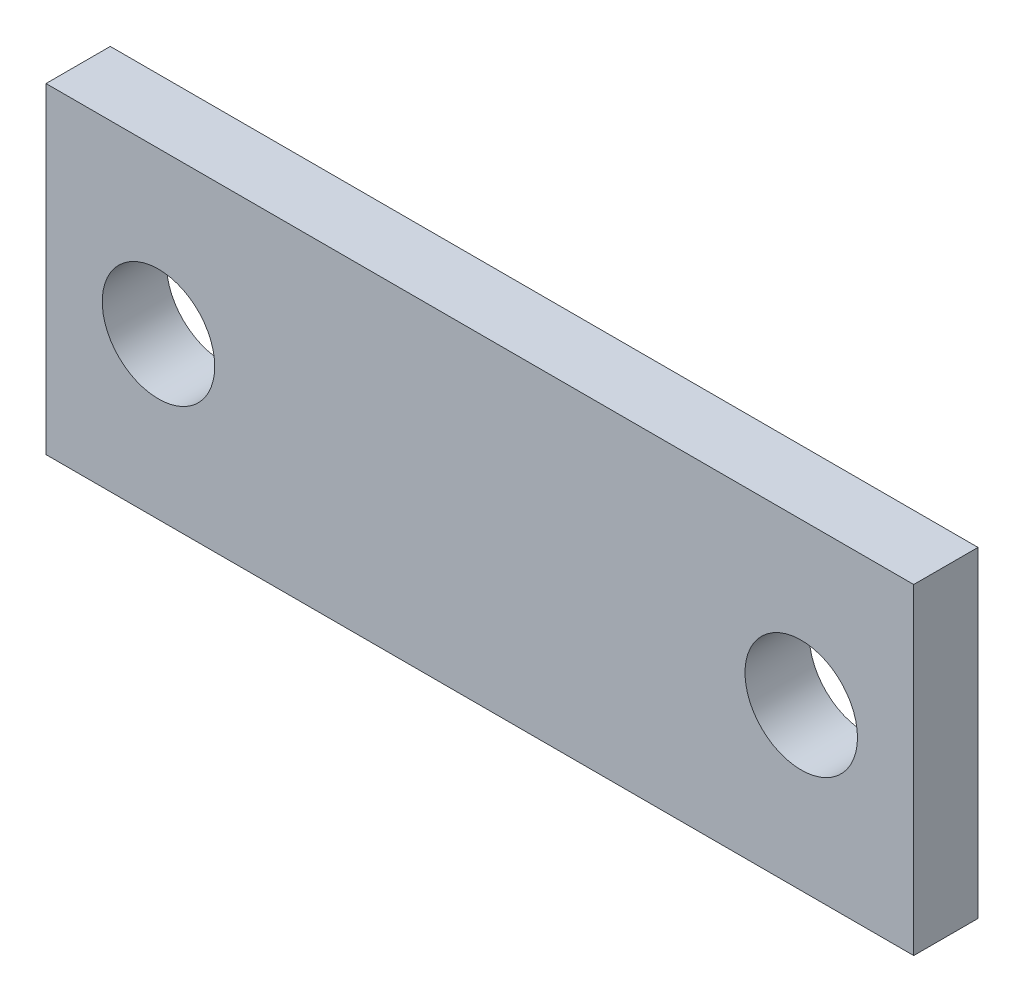
ISO-10303-21;
HEADER;
FILE_DESCRIPTION(('STEP AP214'),'2;1');
FILE_NAME('part.step','',(''),(''),'','','');
FILE_SCHEMA(('AUTOMOTIVE_DESIGN { 1 0 10303 214 1 1 1 1 }'));
ENDSEC;
DATA;
#1=APPLICATION_CONTEXT('core data for automotive mechanical design processes');
#2=APPLICATION_PROTOCOL_DEFINITION('international standard','automotive_design',2000,#1);
#3=PRODUCT_CONTEXT('',#1,'mechanical');
#4=PRODUCT('Part','Part','',(#3));
#5=PRODUCT_RELATED_PRODUCT_CATEGORY('part','',(#4));
#6=PRODUCT_DEFINITION_FORMATION('','',#4);
#7=PRODUCT_DEFINITION_CONTEXT('part definition',#1,'design');
#8=PRODUCT_DEFINITION('design','',#6,#7);
#9=PRODUCT_DEFINITION_SHAPE('','',#8);
#10=(LENGTH_UNIT() NAMED_UNIT(*) SI_UNIT(.MILLI.,.METRE.));
#11=(NAMED_UNIT(*) PLANE_ANGLE_UNIT() SI_UNIT($,.RADIAN.));
#12=(NAMED_UNIT(*) SI_UNIT($,.STERADIAN.) SOLID_ANGLE_UNIT());
#13=UNCERTAINTY_MEASURE_WITH_UNIT(LENGTH_MEASURE(1.E-05),#10,'distance_accuracy_value','');
#14=(GEOMETRIC_REPRESENTATION_CONTEXT(3) GLOBAL_UNCERTAINTY_ASSIGNED_CONTEXT((#13)) GLOBAL_UNIT_ASSIGNED_CONTEXT((#10,
#11,#12)) REPRESENTATION_CONTEXT('',''));
#15=CARTESIAN_POINT('',(0.,0.,0.));
#16=DIRECTION('',(0.,0.,1.));
#17=DIRECTION('',(1.,0.,0.));
#18=AXIS2_PLACEMENT_3D('',#15,#16,#17);
#19=CARTESIAN_POINT('',(0.,0.,2.));
#20=DIRECTION('',(0.,0.,1.));
#21=DIRECTION('',(1.,0.,0.));
#22=AXIS2_PLACEMENT_3D('',#19,#20,#21);
#23=PLANE('',#22);
#24=CARTESIAN_POINT('',(-10.,0.,2.));
#25=DIRECTION('',(0.,0.,1.));
#26=DIRECTION('',(1.,0.,0.));
#27=AXIS2_PLACEMENT_3D('',#24,#25,#26);
#28=CIRCLE('',#27,1.75);
#29=CARTESIAN_POINT('',(-8.25,0.,2.));
#30=VERTEX_POINT('',#29);
#31=EDGE_CURVE('E102',#30,#30,#28,.T.);
#32=ORIENTED_EDGE('',*,*,#31,.F.);
#33=EDGE_LOOP('',(#32));
#34=FACE_BOUND('',#33,.T.);
#35=DIRECTION('',(0.,-1.,0.));
#36=VECTOR('',#35,1.);
#37=CARTESIAN_POINT('',(-13.5,5.,2.));
#38=LINE('',#37,#36);
#39=CARTESIAN_POINT('',(-13.5,5.,2.));
#40=VERTEX_POINT('',#39);
#41=CARTESIAN_POINT('',(-13.5,-5.,2.));
#42=VERTEX_POINT('',#41);
#43=EDGE_CURVE('E87',#40,#42,#38,.T.);
#44=ORIENTED_EDGE('',*,*,#43,.T.);
#45=DIRECTION('',(1.,0.,0.));
#46=VECTOR('',#45,1.);
#47=CARTESIAN_POINT('',(-13.5,-5.,2.));
#48=LINE('',#47,#46);
#49=CARTESIAN_POINT('',(13.5,-5.,2.));
#50=VERTEX_POINT('',#49);
#51=EDGE_CURVE('E82',#42,#50,#48,.T.);
#52=ORIENTED_EDGE('',*,*,#51,.T.);
#53=DIRECTION('',(0.,1.,0.));
#54=VECTOR('',#53,1.);
#55=CARTESIAN_POINT('',(13.5,5.,2.));
#56=LINE('',#55,#54);
#57=CARTESIAN_POINT('',(13.5,5.,2.));
#58=VERTEX_POINT('',#57);
#59=EDGE_CURVE('E85',#50,#58,#56,.T.);
#60=ORIENTED_EDGE('',*,*,#59,.T.);
#61=DIRECTION('',(-1.,0.,0.));
#62=VECTOR('',#61,1.);
#63=CARTESIAN_POINT('',(-13.5,5.,2.));
#64=LINE('',#63,#62);
#65=EDGE_CURVE('E52',#58,#40,#64,.T.);
#66=ORIENTED_EDGE('',*,*,#65,.T.);
#67=EDGE_LOOP('',(#44,#52,#60,#66));
#68=FACE_BOUND('',#67,.T.);
#69=CARTESIAN_POINT('',(10.,0.,2.));
#70=DIRECTION('',(0.,0.,1.));
#71=DIRECTION('',(1.,0.,0.));
#72=AXIS2_PLACEMENT_3D('',#69,#70,#71);
#73=CIRCLE('',#72,1.75);
#74=CARTESIAN_POINT('',(11.75,0.,2.));
#75=VERTEX_POINT('',#74);
#76=EDGE_CURVE('E117',#75,#75,#73,.T.);
#77=ORIENTED_EDGE('',*,*,#76,.F.);
#78=EDGE_LOOP('',(#77));
#79=FACE_BOUND('',#78,.T.);
#80=ADVANCED_FACE('F35',(#34,#68,#79),#23,.T.);
#81=CARTESIAN_POINT('',(0.,0.,0.));
#82=DIRECTION('',(0.,0.,1.));
#83=DIRECTION('',(1.,0.,0.));
#84=AXIS2_PLACEMENT_3D('',#81,#82,#83);
#85=PLANE('',#84);
#86=CARTESIAN_POINT('',(-10.,0.,0.));
#87=DIRECTION('',(0.,0.,1.));
#88=DIRECTION('',(1.,0.,0.));
#89=AXIS2_PLACEMENT_3D('',#86,#87,#88);
#90=CIRCLE('',#89,1.75);
#91=CARTESIAN_POINT('',(-8.25,0.,0.));
#92=VERTEX_POINT('',#91);
#93=EDGE_CURVE('E114',#92,#92,#90,.T.);
#94=ORIENTED_EDGE('',*,*,#93,.T.);
#95=EDGE_LOOP('',(#94));
#96=FACE_BOUND('',#95,.T.);
#97=DIRECTION('',(0.,-1.,0.));
#98=VECTOR('',#97,1.);
#99=CARTESIAN_POINT('',(-13.5,5.,0.));
#100=LINE('',#99,#98);
#101=CARTESIAN_POINT('',(-13.5,5.,0.));
#102=VERTEX_POINT('',#101);
#103=CARTESIAN_POINT('',(-13.5,-5.,0.));
#104=VERTEX_POINT('',#103);
#105=EDGE_CURVE('E99',#102,#104,#100,.T.);
#106=ORIENTED_EDGE('',*,*,#105,.F.);
#107=DIRECTION('',(-1.,0.,0.));
#108=VECTOR('',#107,1.);
#109=CARTESIAN_POINT('',(-13.5,5.,0.));
#110=LINE('',#109,#108);
#111=CARTESIAN_POINT('',(13.5,5.,0.));
#112=VERTEX_POINT('',#111);
#113=EDGE_CURVE('E75',#112,#102,#110,.T.);
#114=ORIENTED_EDGE('',*,*,#113,.F.);
#115=DIRECTION('',(0.,1.,0.));
#116=VECTOR('',#115,1.);
#117=CARTESIAN_POINT('',(13.5,5.,0.));
#118=LINE('',#117,#116);
#119=CARTESIAN_POINT('',(13.5,-5.,0.));
#120=VERTEX_POINT('',#119);
#121=EDGE_CURVE('E69',#120,#112,#118,.T.);
#122=ORIENTED_EDGE('',*,*,#121,.F.);
#123=DIRECTION('',(1.,0.,0.));
#124=VECTOR('',#123,1.);
#125=CARTESIAN_POINT('',(-13.5,-5.,0.));
#126=LINE('',#125,#124);
#127=EDGE_CURVE('E91',#104,#120,#126,.T.);
#128=ORIENTED_EDGE('',*,*,#127,.F.);
#129=EDGE_LOOP('',(#106,#114,#122,#128));
#130=FACE_BOUND('',#129,.T.);
#131=CARTESIAN_POINT('',(10.,0.,0.));
#132=DIRECTION('',(0.,0.,1.));
#133=DIRECTION('',(1.,0.,0.));
#134=AXIS2_PLACEMENT_3D('',#131,#132,#133);
#135=CIRCLE('',#134,1.75);
#136=CARTESIAN_POINT('',(11.75,0.,0.));
#137=VERTEX_POINT('',#136);
#138=EDGE_CURVE('E120',#137,#137,#135,.T.);
#139=ORIENTED_EDGE('',*,*,#138,.T.);
#140=EDGE_LOOP('',(#139));
#141=FACE_BOUND('',#140,.T.);
#142=ADVANCED_FACE('F110',(#96,#130,#141),#85,.F.);
#143=CARTESIAN_POINT('',(-13.5,5.,2.));
#144=DIRECTION('',(1.,0.,0.));
#145=DIRECTION('',(0.,1.,0.));
#146=AXIS2_PLACEMENT_3D('',#143,#144,#145);
#147=PLANE('',#146);
#148=ORIENTED_EDGE('',*,*,#105,.T.);
#149=DIRECTION('',(0.,0.,-1.));
#150=VECTOR('',#149,1.);
#151=CARTESIAN_POINT('',(-13.5,-5.,2.));
#152=LINE('',#151,#150);
#153=EDGE_CURVE('E11',#42,#104,#152,.T.);
#154=ORIENTED_EDGE('',*,*,#153,.F.);
#155=ORIENTED_EDGE('',*,*,#43,.F.);
#156=DIRECTION('',(0.,0.,-1.));
#157=VECTOR('',#156,1.);
#158=CARTESIAN_POINT('',(-13.5,5.,2.));
#159=LINE('',#158,#157);
#160=EDGE_CURVE('E95',#40,#102,#159,.T.);
#161=ORIENTED_EDGE('',*,*,#160,.T.);
#162=EDGE_LOOP('',(#148,#154,#155,#161));
#163=FACE_BOUND('',#162,.T.);
#164=ADVANCED_FACE('F37',(#163),#147,.F.);
#165=CARTESIAN_POINT('',(-13.5,-5.,2.));
#166=DIRECTION('',(0.,1.,0.));
#167=DIRECTION('',(0.,0.,1.));
#168=AXIS2_PLACEMENT_3D('',#165,#166,#167);
#169=PLANE('',#168);
#170=ORIENTED_EDGE('',*,*,#127,.T.);
#171=DIRECTION('',(0.,0.,-1.));
#172=VECTOR('',#171,1.);
#173=CARTESIAN_POINT('',(13.5,-5.,2.));
#174=LINE('',#173,#172);
#175=EDGE_CURVE('E44',#50,#120,#174,.T.);
#176=ORIENTED_EDGE('',*,*,#175,.F.);
#177=ORIENTED_EDGE('',*,*,#51,.F.);
#178=ORIENTED_EDGE('',*,*,#153,.T.);
#179=EDGE_LOOP('',(#170,#176,#177,#178));
#180=FACE_BOUND('',#179,.T.);
#181=ADVANCED_FACE('F90',(#180),#169,.F.);
#182=CARTESIAN_POINT('',(13.5,5.,2.));
#183=DIRECTION('',(-1.,0.,0.));
#184=DIRECTION('',(0.,0.,1.));
#185=AXIS2_PLACEMENT_3D('',#182,#183,#184);
#186=PLANE('',#185);
#187=ORIENTED_EDGE('',*,*,#121,.T.);
#188=DIRECTION('',(0.,0.,-1.));
#189=VECTOR('',#188,1.);
#190=CARTESIAN_POINT('',(13.5,5.,2.));
#191=LINE('',#190,#189);
#192=EDGE_CURVE('E92',#58,#112,#191,.T.);
#193=ORIENTED_EDGE('',*,*,#192,.F.);
#194=ORIENTED_EDGE('',*,*,#59,.F.);
#195=ORIENTED_EDGE('',*,*,#175,.T.);
#196=EDGE_LOOP('',(#187,#193,#194,#195));
#197=FACE_BOUND('',#196,.T.);
#198=ADVANCED_FACE('F93',(#197),#186,.F.);
#199=CARTESIAN_POINT('',(-13.5,5.,2.));
#200=DIRECTION('',(0.,-1.,0.));
#201=DIRECTION('',(1.,0.,0.));
#202=AXIS2_PLACEMENT_3D('',#199,#200,#201);
#203=PLANE('',#202);
#204=ORIENTED_EDGE('',*,*,#113,.T.);
#205=ORIENTED_EDGE('',*,*,#160,.F.);
#206=ORIENTED_EDGE('',*,*,#65,.F.);
#207=ORIENTED_EDGE('',*,*,#192,.T.);
#208=EDGE_LOOP('',(#204,#205,#206,#207));
#209=FACE_BOUND('',#208,.T.);
#210=ADVANCED_FACE('F107',(#209),#203,.F.);
#211=CARTESIAN_POINT('',(-10.,0.,2.));
#212=DIRECTION('',(0.,0.,-1.));
#213=DIRECTION('',(-1.,0.,0.));
#214=AXIS2_PLACEMENT_3D('',#211,#212,#213);
#215=CYLINDRICAL_SURFACE('',#214,1.75);
#216=ORIENTED_EDGE('',*,*,#31,.T.);
#217=EDGE_LOOP('',(#216));
#218=FACE_BOUND('',#217,.T.);
#219=ORIENTED_EDGE('',*,*,#93,.F.);
#220=EDGE_LOOP('',(#219));
#221=FACE_BOUND('',#220,.T.);
#222=ADVANCED_FACE('F138',(#218,#221),#215,.F.);
#223=CARTESIAN_POINT('',(10.,0.,2.));
#224=DIRECTION('',(0.,0.,-1.));
#225=DIRECTION('',(-1.,0.,0.));
#226=AXIS2_PLACEMENT_3D('',#223,#224,#225);
#227=CYLINDRICAL_SURFACE('',#226,1.75);
#228=ORIENTED_EDGE('',*,*,#76,.T.);
#229=EDGE_LOOP('',(#228));
#230=FACE_BOUND('',#229,.T.);
#231=ORIENTED_EDGE('',*,*,#138,.F.);
#232=EDGE_LOOP('',(#231));
#233=FACE_BOUND('',#232,.T.);
#234=ADVANCED_FACE('F126',(#230,#233),#227,.F.);
#235=CLOSED_SHELL('',(#80,#142,#164,#181,#198,#210,#222,#234));
#236=MANIFOLD_SOLID_BREP('B2',#235);
#237=ADVANCED_BREP_SHAPE_REPRESENTATION('',(#18,#236),#14);
#238=SHAPE_DEFINITION_REPRESENTATION(#9,#237);
ENDSEC;
END-ISO-10303-21;
